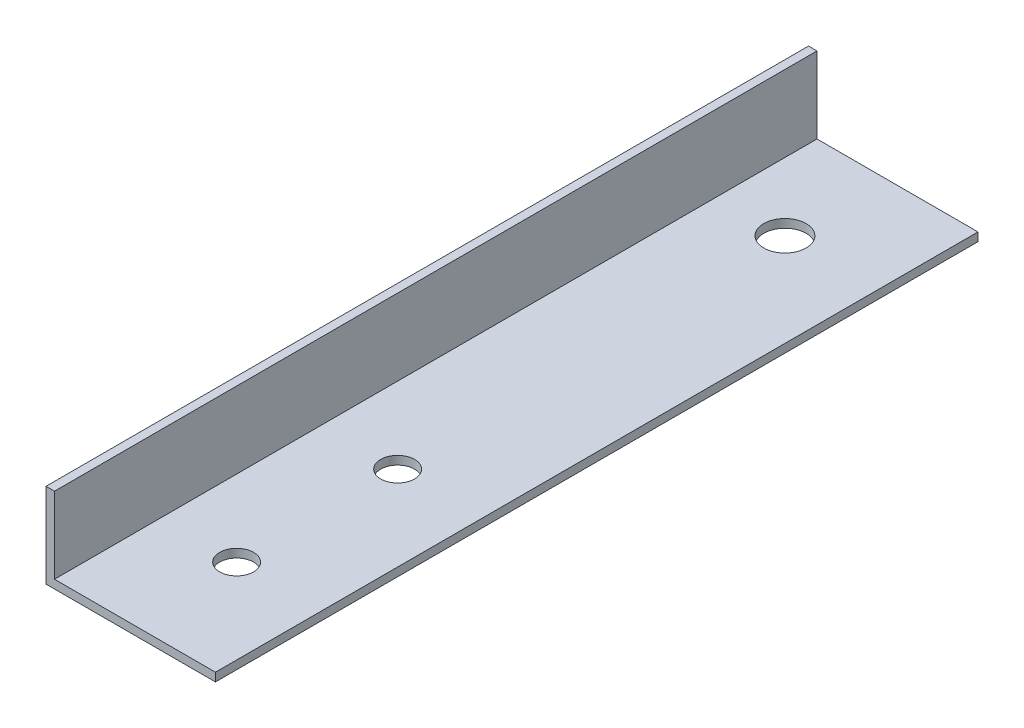
ISO-10303-21;
HEADER;
FILE_DESCRIPTION(('STEP AP214'),'2;1');
FILE_NAME('part.step','',(''),(''),'','','');
FILE_SCHEMA(('AUTOMOTIVE_DESIGN { 1 0 10303 214 1 1 1 1 }'));
ENDSEC;
DATA;
#1=APPLICATION_CONTEXT('core data for automotive mechanical design processes');
#2=APPLICATION_PROTOCOL_DEFINITION('international standard','automotive_design',2000,#1);
#3=PRODUCT_CONTEXT('',#1,'mechanical');
#4=PRODUCT('Part','Part','',(#3));
#5=PRODUCT_RELATED_PRODUCT_CATEGORY('part','',(#4));
#6=PRODUCT_DEFINITION_FORMATION('','',#4);
#7=PRODUCT_DEFINITION_CONTEXT('part definition',#1,'design');
#8=PRODUCT_DEFINITION('design','',#6,#7);
#9=PRODUCT_DEFINITION_SHAPE('','',#8);
#10=(LENGTH_UNIT() NAMED_UNIT(*) SI_UNIT(.MILLI.,.METRE.));
#11=(NAMED_UNIT(*) PLANE_ANGLE_UNIT() SI_UNIT($,.RADIAN.));
#12=(NAMED_UNIT(*) SI_UNIT($,.STERADIAN.) SOLID_ANGLE_UNIT());
#13=UNCERTAINTY_MEASURE_WITH_UNIT(LENGTH_MEASURE(1.E-05),#10,'distance_accuracy_value','');
#14=(GEOMETRIC_REPRESENTATION_CONTEXT(3) GLOBAL_UNCERTAINTY_ASSIGNED_CONTEXT((#13)) GLOBAL_UNIT_ASSIGNED_CONTEXT((#10,
#11,#12)) REPRESENTATION_CONTEXT('',''));
#15=CARTESIAN_POINT('',(0.,0.,0.));
#16=DIRECTION('',(0.,0.,1.));
#17=DIRECTION('',(1.,0.,0.));
#18=AXIS2_PLACEMENT_3D('',#15,#16,#17);
#19=CARTESIAN_POINT('',(-69.5798319327731,11.327731092437,180.));
#20=DIRECTION('',(1.,0.,0.));
#21=DIRECTION('',(0.,0.,-1.));
#22=AXIS2_PLACEMENT_3D('',#19,#20,#21);
#23=PLANE('',#22);
#24=DIRECTION('',(0.,-1.,0.));
#25=VECTOR('',#24,1.);
#26=CARTESIAN_POINT('',(-69.5798319327731,11.327731092437,0.));
#27=LINE('',#26,#25);
#28=CARTESIAN_POINT('',(-69.5798319327731,29.327731092437,0.));
#29=VERTEX_POINT('',#28);
#30=CARTESIAN_POINT('',(-69.5798319327731,9.32773109243698,0.));
#31=VERTEX_POINT('',#30);
#32=EDGE_CURVE('E81',#29,#31,#27,.T.);
#33=ORIENTED_EDGE('',*,*,#32,.T.);
#34=DIRECTION('',(0.,0.,-1.));
#35=VECTOR('',#34,1.);
#36=CARTESIAN_POINT('',(-69.5798319327731,9.32773109243698,180.));
#37=LINE('',#36,#35);
#38=CARTESIAN_POINT('',(-69.5798319327731,9.32773109243698,180.));
#39=VERTEX_POINT('',#38);
#40=EDGE_CURVE('E11',#39,#31,#37,.T.);
#41=ORIENTED_EDGE('',*,*,#40,.F.);
#42=DIRECTION('',(0.,-1.,0.));
#43=VECTOR('',#42,1.);
#44=CARTESIAN_POINT('',(-69.5798319327731,29.327731092437,180.));
#45=LINE('',#44,#43);
#46=CARTESIAN_POINT('',(-69.5798319327731,29.327731092437,180.));
#47=VERTEX_POINT('',#46);
#48=EDGE_CURVE('E87',#47,#39,#45,.T.);
#49=ORIENTED_EDGE('',*,*,#48,.F.);
#50=DIRECTION('',(0.,0.,-1.));
#51=VECTOR('',#50,1.);
#52=CARTESIAN_POINT('',(-69.5798319327731,29.327731092437,180.));
#53=LINE('',#52,#51);
#54=EDGE_CURVE('E115',#47,#29,#53,.T.);
#55=ORIENTED_EDGE('',*,*,#54,.T.);
#56=EDGE_LOOP('',(#33,#41,#49,#55));
#57=FACE_BOUND('',#56,.T.);
#58=ADVANCED_FACE('F33',(#57),#23,.F.);
#59=CARTESIAN_POINT('',(-69.5798319327731,9.32773109243698,180.));
#60=DIRECTION('',(0.,1.,0.));
#61=DIRECTION('',(0.,0.,1.));
#62=AXIS2_PLACEMENT_3D('',#59,#60,#61);
#63=PLANE('',#62);
#64=CARTESIAN_POINT('',(-49.5798319327732,9.32773109243698,155.));
#65=DIRECTION('',(0.,-1.,0.));
#66=DIRECTION('',(0.,0.,-1.));
#67=AXIS2_PLACEMENT_3D('',#64,#65,#66);
#68=CIRCLE('',#67,4.00000000000001);
#69=CARTESIAN_POINT('',(-49.5798319327732,9.32773109243698,151.));
#70=VERTEX_POINT('',#69);
#71=EDGE_CURVE('E137',#70,#70,#68,.T.);
#72=ORIENTED_EDGE('',*,*,#71,.F.);
#73=EDGE_LOOP('',(#72));
#74=FACE_BOUND('',#73,.T.);
#75=CARTESIAN_POINT('',(-49.5798319327732,9.32773109243698,117.));
#76=DIRECTION('',(0.,-1.,0.));
#77=DIRECTION('',(0.,0.,-1.));
#78=AXIS2_PLACEMENT_3D('',#75,#76,#77);
#79=CIRCLE('',#78,4.00000000000001);
#80=CARTESIAN_POINT('',(-49.5798319327732,9.32773109243698,113.));
#81=VERTEX_POINT('',#80);
#82=EDGE_CURVE('E178',#81,#81,#79,.T.);
#83=ORIENTED_EDGE('',*,*,#82,.F.);
#84=EDGE_LOOP('',(#83));
#85=FACE_BOUND('',#84,.T.);
#86=CARTESIAN_POINT('',(-51.5798319327731,9.32773109243698,23.5740548904657));
#87=DIRECTION('',(0.,-1.,0.));
#88=DIRECTION('',(0.,0.,-1.));
#89=AXIS2_PLACEMENT_3D('',#86,#87,#88);
#90=CIRCLE('',#89,5.);
#91=CARTESIAN_POINT('',(-51.5798319327731,9.32773109243698,18.5740548904657));
#92=VERTEX_POINT('',#91);
#93=EDGE_CURVE('E175',#92,#92,#90,.T.);
#94=ORIENTED_EDGE('',*,*,#93,.F.);
#95=EDGE_LOOP('',(#94));
#96=FACE_BOUND('',#95,.T.);
#97=DIRECTION('',(1.,0.,0.));
#98=VECTOR('',#97,1.);
#99=CARTESIAN_POINT('',(-69.5798319327731,9.32773109243698,0.));
#100=LINE('',#99,#98);
#101=CARTESIAN_POINT('',(-29.5798319327731,9.32773109243698,0.));
#102=VERTEX_POINT('',#101);
#103=EDGE_CURVE('E120',#31,#102,#100,.T.);
#104=ORIENTED_EDGE('',*,*,#103,.T.);
#105=DIRECTION('',(0.,0.,-1.));
#106=VECTOR('',#105,1.);
#107=CARTESIAN_POINT('',(-29.5798319327731,9.32773109243698,180.));
#108=LINE('',#107,#106);
#109=CARTESIAN_POINT('',(-29.5798319327731,9.32773109243698,180.));
#110=VERTEX_POINT('',#109);
#111=EDGE_CURVE('E42',#110,#102,#108,.T.);
#112=ORIENTED_EDGE('',*,*,#111,.F.);
#113=DIRECTION('',(1.,0.,0.));
#114=VECTOR('',#113,1.);
#115=CARTESIAN_POINT('',(-69.5798319327731,9.32773109243698,180.));
#116=LINE('',#115,#114);
#117=EDGE_CURVE('E168',#39,#110,#116,.T.);
#118=ORIENTED_EDGE('',*,*,#117,.F.);
#119=ORIENTED_EDGE('',*,*,#40,.T.);
#120=EDGE_LOOP('',(#104,#112,#118,#119));
#121=FACE_BOUND('',#120,.T.);
#122=ADVANCED_FACE('F158',(#74,#85,#96,#121),#63,.F.);
#123=CARTESIAN_POINT('',(-29.5798319327731,11.327731092437,180.));
#124=DIRECTION('',(-1.,0.,0.));
#125=DIRECTION('',(0.,-1.,0.));
#126=AXIS2_PLACEMENT_3D('',#123,#124,#125);
#127=PLANE('',#126);
#128=DIRECTION('',(0.,1.,0.));
#129=VECTOR('',#128,1.);
#130=CARTESIAN_POINT('',(-29.5798319327731,11.327731092437,0.));
#131=LINE('',#130,#129);
#132=CARTESIAN_POINT('',(-29.5798319327731,11.327731092437,0.));
#133=VERTEX_POINT('',#132);
#134=EDGE_CURVE('E122',#102,#133,#131,.T.);
#135=ORIENTED_EDGE('',*,*,#134,.T.);
#136=DIRECTION('',(0.,0.,-1.));
#137=VECTOR('',#136,1.);
#138=CARTESIAN_POINT('',(-29.5798319327731,11.327731092437,180.));
#139=LINE('',#138,#137);
#140=CARTESIAN_POINT('',(-29.5798319327731,11.327731092437,180.));
#141=VERTEX_POINT('',#140);
#142=EDGE_CURVE('E110',#141,#133,#139,.T.);
#143=ORIENTED_EDGE('',*,*,#142,.F.);
#144=DIRECTION('',(0.,1.,0.));
#145=VECTOR('',#144,1.);
#146=CARTESIAN_POINT('',(-29.5798319327731,11.327731092437,180.));
#147=LINE('',#146,#145);
#148=EDGE_CURVE('E101',#110,#141,#147,.T.);
#149=ORIENTED_EDGE('',*,*,#148,.F.);
#150=ORIENTED_EDGE('',*,*,#111,.T.);
#151=EDGE_LOOP('',(#135,#143,#149,#150));
#152=FACE_BOUND('',#151,.T.);
#153=ADVANCED_FACE('F163',(#152),#127,.F.);
#154=CARTESIAN_POINT('',(-67.5798319327731,11.327731092437,180.));
#155=DIRECTION('',(0.,-1.,0.));
#156=DIRECTION('',(0.,0.,-1.));
#157=AXIS2_PLACEMENT_3D('',#154,#155,#156);
#158=PLANE('',#157);
#159=CARTESIAN_POINT('',(-49.5798319327732,11.327731092437,155.));
#160=DIRECTION('',(0.,-1.,0.));
#161=DIRECTION('',(0.,0.,-1.));
#162=AXIS2_PLACEMENT_3D('',#159,#160,#161);
#163=CIRCLE('',#162,4.00000000000001);
#164=CARTESIAN_POINT('',(-49.5798319327732,11.327731092437,151.));
#165=VERTEX_POINT('',#164);
#166=EDGE_CURVE('E36',#165,#165,#163,.T.);
#167=ORIENTED_EDGE('',*,*,#166,.T.);
#168=EDGE_LOOP('',(#167));
#169=FACE_BOUND('',#168,.T.);
#170=CARTESIAN_POINT('',(-49.5798319327732,11.327731092437,117.));
#171=DIRECTION('',(0.,-1.,0.));
#172=DIRECTION('',(0.,0.,-1.));
#173=AXIS2_PLACEMENT_3D('',#170,#171,#172);
#174=CIRCLE('',#173,4.00000000000001);
#175=CARTESIAN_POINT('',(-49.5798319327732,11.327731092437,113.));
#176=VERTEX_POINT('',#175);
#177=EDGE_CURVE('E136',#176,#176,#174,.T.);
#178=ORIENTED_EDGE('',*,*,#177,.T.);
#179=EDGE_LOOP('',(#178));
#180=FACE_BOUND('',#179,.T.);
#181=CARTESIAN_POINT('',(-51.5798319327731,11.327731092437,23.5740548904657));
#182=DIRECTION('',(0.,-1.,0.));
#183=DIRECTION('',(0.,0.,-1.));
#184=AXIS2_PLACEMENT_3D('',#181,#182,#183);
#185=CIRCLE('',#184,5.);
#186=CARTESIAN_POINT('',(-51.5798319327731,11.327731092437,18.5740548904657));
#187=VERTEX_POINT('',#186);
#188=EDGE_CURVE('E134',#187,#187,#185,.T.);
#189=ORIENTED_EDGE('',*,*,#188,.T.);
#190=EDGE_LOOP('',(#189));
#191=FACE_BOUND('',#190,.T.);
#192=DIRECTION('',(-1.,0.,0.));
#193=VECTOR('',#192,1.);
#194=CARTESIAN_POINT('',(-67.5798319327731,11.327731092437,0.));
#195=LINE('',#194,#193);
#196=CARTESIAN_POINT('',(-67.5798319327731,11.327731092437,0.));
#197=VERTEX_POINT('',#196);
#198=EDGE_CURVE('E109',#133,#197,#195,.T.);
#199=ORIENTED_EDGE('',*,*,#198,.T.);
#200=DIRECTION('',(0.,0.,-1.));
#201=VECTOR('',#200,1.);
#202=CARTESIAN_POINT('',(-67.5798319327731,11.327731092437,180.));
#203=LINE('',#202,#201);
#204=CARTESIAN_POINT('',(-67.5798319327731,11.327731092437,180.));
#205=VERTEX_POINT('',#204);
#206=EDGE_CURVE('E106',#205,#197,#203,.T.);
#207=ORIENTED_EDGE('',*,*,#206,.F.);
#208=DIRECTION('',(-1.,0.,0.));
#209=VECTOR('',#208,1.);
#210=CARTESIAN_POINT('',(-67.5798319327731,11.327731092437,180.));
#211=LINE('',#210,#209);
#212=EDGE_CURVE('E95',#141,#205,#211,.T.);
#213=ORIENTED_EDGE('',*,*,#212,.F.);
#214=ORIENTED_EDGE('',*,*,#142,.T.);
#215=EDGE_LOOP('',(#199,#207,#213,#214));
#216=FACE_BOUND('',#215,.T.);
#217=ADVANCED_FACE('F107',(#169,#180,#191,#216),#158,.F.);
#218=CARTESIAN_POINT('',(-67.5798319327731,29.327731092437,180.));
#219=DIRECTION('',(-1.,0.,0.));
#220=DIRECTION('',(0.,0.,1.));
#221=AXIS2_PLACEMENT_3D('',#218,#219,#220);
#222=PLANE('',#221);
#223=DIRECTION('',(0.,1.,0.));
#224=VECTOR('',#223,1.);
#225=CARTESIAN_POINT('',(-67.5798319327731,29.327731092437,0.));
#226=LINE('',#225,#224);
#227=CARTESIAN_POINT('',(-67.5798319327731,29.327731092437,0.));
#228=VERTEX_POINT('',#227);
#229=EDGE_CURVE('E74',#197,#228,#226,.T.);
#230=ORIENTED_EDGE('',*,*,#229,.T.);
#231=DIRECTION('',(0.,0.,-1.));
#232=VECTOR('',#231,1.);
#233=CARTESIAN_POINT('',(-67.5798319327731,29.327731092437,180.));
#234=LINE('',#233,#232);
#235=CARTESIAN_POINT('',(-67.5798319327731,29.327731092437,180.));
#236=VERTEX_POINT('',#235);
#237=EDGE_CURVE('E111',#236,#228,#234,.T.);
#238=ORIENTED_EDGE('',*,*,#237,.F.);
#239=DIRECTION('',(0.,1.,0.));
#240=VECTOR('',#239,1.);
#241=CARTESIAN_POINT('',(-67.5798319327731,29.327731092437,180.));
#242=LINE('',#241,#240);
#243=EDGE_CURVE('E99',#205,#236,#242,.T.);
#244=ORIENTED_EDGE('',*,*,#243,.F.);
#245=ORIENTED_EDGE('',*,*,#206,.T.);
#246=EDGE_LOOP('',(#230,#238,#244,#245));
#247=FACE_BOUND('',#246,.T.);
#248=ADVANCED_FACE('F113',(#247),#222,.F.);
#249=CARTESIAN_POINT('',(-69.5798319327731,29.327731092437,180.));
#250=DIRECTION('',(0.,-1.,0.));
#251=DIRECTION('',(0.,0.,-1.));
#252=AXIS2_PLACEMENT_3D('',#249,#250,#251);
#253=PLANE('',#252);
#254=DIRECTION('',(-1.,0.,0.));
#255=VECTOR('',#254,1.);
#256=CARTESIAN_POINT('',(-69.5798319327731,29.327731092437,0.));
#257=LINE('',#256,#255);
#258=EDGE_CURVE('E126',#228,#29,#257,.T.);
#259=ORIENTED_EDGE('',*,*,#258,.T.);
#260=ORIENTED_EDGE('',*,*,#54,.F.);
#261=DIRECTION('',(-1.,0.,0.));
#262=VECTOR('',#261,1.);
#263=CARTESIAN_POINT('',(-69.5798319327731,29.327731092437,180.));
#264=LINE('',#263,#262);
#265=EDGE_CURVE('E51',#236,#47,#264,.T.);
#266=ORIENTED_EDGE('',*,*,#265,.F.);
#267=ORIENTED_EDGE('',*,*,#237,.T.);
#268=EDGE_LOOP('',(#259,#260,#266,#267));
#269=FACE_BOUND('',#268,.T.);
#270=ADVANCED_FACE('F198',(#269),#253,.F.);
#271=CARTESIAN_POINT('',(0.,0.,180.));
#272=DIRECTION('',(0.,0.,1.));
#273=DIRECTION('',(1.,0.,0.));
#274=AXIS2_PLACEMENT_3D('',#271,#272,#273);
#275=PLANE('',#274);
#276=ORIENTED_EDGE('',*,*,#48,.T.);
#277=ORIENTED_EDGE('',*,*,#117,.T.);
#278=ORIENTED_EDGE('',*,*,#148,.T.);
#279=ORIENTED_EDGE('',*,*,#212,.T.);
#280=ORIENTED_EDGE('',*,*,#243,.T.);
#281=ORIENTED_EDGE('',*,*,#265,.T.);
#282=EDGE_LOOP('',(#276,#277,#278,#279,#280,#281));
#283=FACE_BOUND('',#282,.T.);
#284=ADVANCED_FACE('F97',(#283),#275,.T.);
#285=CARTESIAN_POINT('',(0.,0.,0.));
#286=DIRECTION('',(0.,0.,1.));
#287=DIRECTION('',(1.,0.,0.));
#288=AXIS2_PLACEMENT_3D('',#285,#286,#287);
#289=PLANE('',#288);
#290=ORIENTED_EDGE('',*,*,#32,.F.);
#291=ORIENTED_EDGE('',*,*,#258,.F.);
#292=ORIENTED_EDGE('',*,*,#229,.F.);
#293=ORIENTED_EDGE('',*,*,#198,.F.);
#294=ORIENTED_EDGE('',*,*,#134,.F.);
#295=ORIENTED_EDGE('',*,*,#103,.F.);
#296=EDGE_LOOP('',(#290,#291,#292,#293,#294,#295));
#297=FACE_BOUND('',#296,.T.);
#298=ADVANCED_FACE('F170',(#297),#289,.F.);
#299=CARTESIAN_POINT('',(-51.5798319327731,19.327731092437,23.5740548904657));
#300=DIRECTION('',(0.,-1.,0.));
#301=DIRECTION('',(0.,0.,-1.));
#302=AXIS2_PLACEMENT_3D('',#299,#300,#301);
#303=CYLINDRICAL_SURFACE('',#302,5.);
#304=ORIENTED_EDGE('',*,*,#93,.T.);
#305=EDGE_LOOP('',(#304));
#306=FACE_BOUND('',#305,.T.);
#307=ORIENTED_EDGE('',*,*,#188,.F.);
#308=EDGE_LOOP('',(#307));
#309=FACE_BOUND('',#308,.T.);
#310=ADVANCED_FACE('F153',(#306,#309),#303,.F.);
#311=CARTESIAN_POINT('',(-49.5798319327732,19.327731092437,117.));
#312=DIRECTION('',(0.,-1.,0.));
#313=DIRECTION('',(0.,0.,-1.));
#314=AXIS2_PLACEMENT_3D('',#311,#312,#313);
#315=CYLINDRICAL_SURFACE('',#314,4.00000000000001);
#316=ORIENTED_EDGE('',*,*,#82,.T.);
#317=EDGE_LOOP('',(#316));
#318=FACE_BOUND('',#317,.T.);
#319=ORIENTED_EDGE('',*,*,#177,.F.);
#320=EDGE_LOOP('',(#319));
#321=FACE_BOUND('',#320,.T.);
#322=ADVANCED_FACE('F147',(#318,#321),#315,.F.);
#323=CARTESIAN_POINT('',(-49.5798319327732,19.327731092437,155.));
#324=DIRECTION('',(0.,-1.,0.));
#325=DIRECTION('',(0.,0.,-1.));
#326=AXIS2_PLACEMENT_3D('',#323,#324,#325);
#327=CYLINDRICAL_SURFACE('',#326,4.00000000000001);
#328=ORIENTED_EDGE('',*,*,#71,.T.);
#329=EDGE_LOOP('',(#328));
#330=FACE_BOUND('',#329,.T.);
#331=ORIENTED_EDGE('',*,*,#166,.F.);
#332=EDGE_LOOP('',(#331));
#333=FACE_BOUND('',#332,.T.);
#334=ADVANCED_FACE('F145',(#330,#333),#327,.F.);
#335=CLOSED_SHELL('',(#58,#122,#153,#217,#248,#270,#284,#298,#310,#322,#334));
#336=MANIFOLD_SOLID_BREP('B2',#335);
#337=ADVANCED_BREP_SHAPE_REPRESENTATION('',(#18,#336),#14);
#338=SHAPE_DEFINITION_REPRESENTATION(#9,#337);
ENDSEC;
END-ISO-10303-21;
